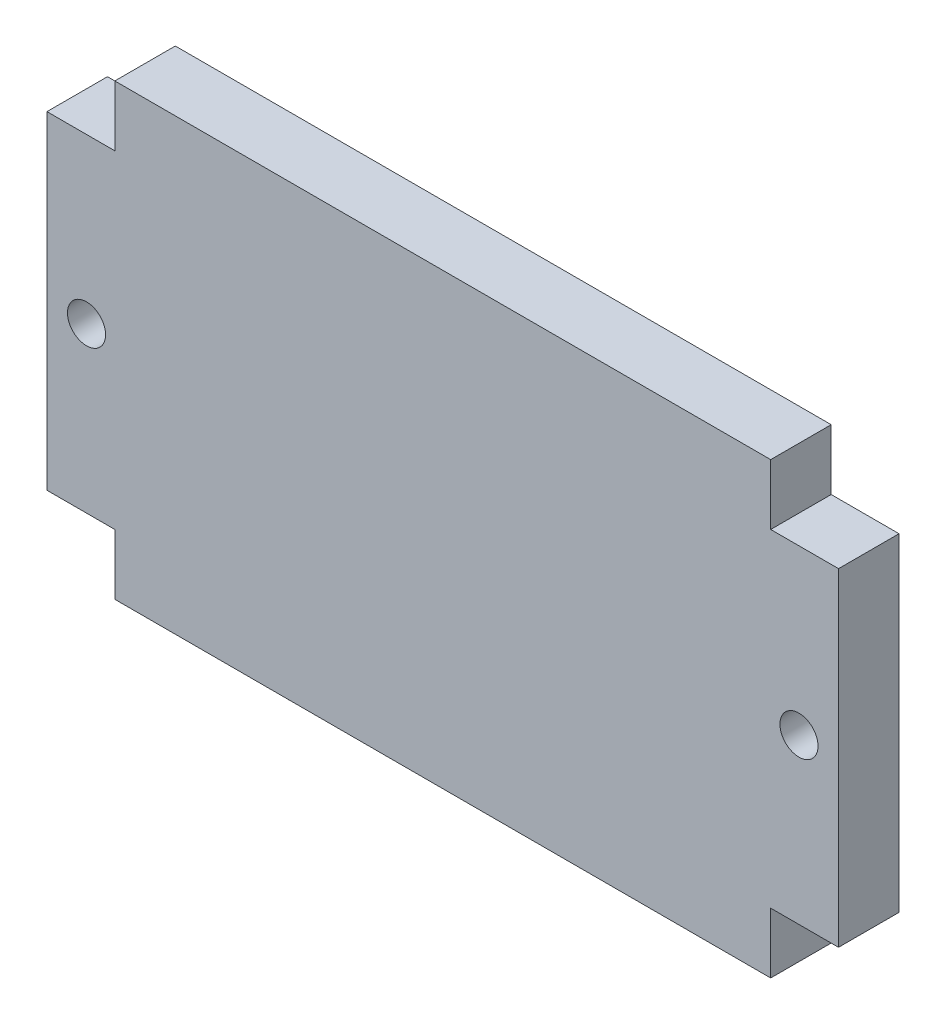
ISO-10303-21;
HEADER;
FILE_DESCRIPTION(('STEP AP214'),'2;1');
FILE_NAME('part.step','',(''),(''),'','','');
FILE_SCHEMA(('AUTOMOTIVE_DESIGN { 1 0 10303 214 1 1 1 1 }'));
ENDSEC;
DATA;
#1=APPLICATION_CONTEXT('core data for automotive mechanical design processes');
#2=APPLICATION_PROTOCOL_DEFINITION('international standard','automotive_design',2000,#1);
#3=PRODUCT_CONTEXT('',#1,'mechanical');
#4=PRODUCT('Part','Part','',(#3));
#5=PRODUCT_RELATED_PRODUCT_CATEGORY('part','',(#4));
#6=PRODUCT_DEFINITION_FORMATION('','',#4);
#7=PRODUCT_DEFINITION_CONTEXT('part definition',#1,'design');
#8=PRODUCT_DEFINITION('design','',#6,#7);
#9=PRODUCT_DEFINITION_SHAPE('','',#8);
#10=(LENGTH_UNIT() NAMED_UNIT(*) SI_UNIT(.MILLI.,.METRE.));
#11=(NAMED_UNIT(*) PLANE_ANGLE_UNIT() SI_UNIT($,.RADIAN.));
#12=(NAMED_UNIT(*) SI_UNIT($,.STERADIAN.) SOLID_ANGLE_UNIT());
#13=UNCERTAINTY_MEASURE_WITH_UNIT(LENGTH_MEASURE(1.E-05),#10,'distance_accuracy_value','');
#14=(GEOMETRIC_REPRESENTATION_CONTEXT(3) GLOBAL_UNCERTAINTY_ASSIGNED_CONTEXT((#13)) GLOBAL_UNIT_ASSIGNED_CONTEXT((#10,
#11,#12)) REPRESENTATION_CONTEXT('',''));
#15=CARTESIAN_POINT('',(0.,0.,0.));
#16=DIRECTION('',(0.,0.,1.));
#17=DIRECTION('',(1.,0.,0.));
#18=AXIS2_PLACEMENT_3D('',#15,#16,#17);
#19=CARTESIAN_POINT('',(0.,0.,5.35));
#20=DIRECTION('',(0.,0.,1.));
#21=DIRECTION('',(1.,0.,0.));
#22=AXIS2_PLACEMENT_3D('',#19,#20,#21);
#23=PLANE('',#22);
#24=CARTESIAN_POINT('',(-31.5,19.85,5.35));
#25=DIRECTION('',(0.,0.,1.));
#26=DIRECTION('',(1.,0.,0.));
#27=AXIS2_PLACEMENT_3D('',#24,#25,#26);
#28=CIRCLE('',#27,1.685);
#29=CARTESIAN_POINT('',(-29.815,19.85,5.35));
#30=VERTEX_POINT('',#29);
#31=EDGE_CURVE('E157',#30,#30,#28,.T.);
#32=ORIENTED_EDGE('',*,*,#31,.F.);
#33=EDGE_LOOP('',(#32));
#34=FACE_BOUND('',#33,.T.);
#35=DIRECTION('',(0.,-1.,0.));
#36=VECTOR('',#35,1.);
#37=CARTESIAN_POINT('',(-29.,0.,5.35));
#38=LINE('',#37,#36);
#39=CARTESIAN_POINT('',(-29.,5.35,5.35));
#40=VERTEX_POINT('',#39);
#41=CARTESIAN_POINT('',(-29.,0.,5.35));
#42=VERTEX_POINT('',#41);
#43=EDGE_CURVE('E176',#40,#42,#38,.T.);
#44=ORIENTED_EDGE('',*,*,#43,.T.);
#45=DIRECTION('',(1.,0.,0.));
#46=VECTOR('',#45,1.);
#47=CARTESIAN_POINT('',(-29.,0.,5.35));
#48=LINE('',#47,#46);
#49=CARTESIAN_POINT('',(29.,0.,5.35));
#50=VERTEX_POINT('',#49);
#51=EDGE_CURVE('E104',#42,#50,#48,.T.);
#52=ORIENTED_EDGE('',*,*,#51,.T.);
#53=DIRECTION('',(0.,1.,0.));
#54=VECTOR('',#53,1.);
#55=CARTESIAN_POINT('',(29.,0.,5.35));
#56=LINE('',#55,#54);
#57=CARTESIAN_POINT('',(29.,5.35,5.35));
#58=VERTEX_POINT('',#57);
#59=EDGE_CURVE('E203',#50,#58,#56,.T.);
#60=ORIENTED_EDGE('',*,*,#59,.T.);
#61=DIRECTION('',(1.,0.,0.));
#62=VECTOR('',#61,1.);
#63=CARTESIAN_POINT('',(29.,5.35,5.35));
#64=LINE('',#63,#62);
#65=CARTESIAN_POINT('',(35.,5.35,5.35));
#66=VERTEX_POINT('',#65);
#67=EDGE_CURVE('E222',#58,#66,#64,.T.);
#68=ORIENTED_EDGE('',*,*,#67,.T.);
#69=DIRECTION('',(0.,1.,0.));
#70=VECTOR('',#69,1.);
#71=CARTESIAN_POINT('',(35.,34.35,5.35));
#72=LINE('',#71,#70);
#73=CARTESIAN_POINT('',(35.,34.35,5.35));
#74=VERTEX_POINT('',#73);
#75=EDGE_CURVE('E219',#66,#74,#72,.T.);
#76=ORIENTED_EDGE('',*,*,#75,.T.);
#77=DIRECTION('',(-1.,0.,0.));
#78=VECTOR('',#77,1.);
#79=CARTESIAN_POINT('',(29.,34.35,5.35));
#80=LINE('',#79,#78);
#81=CARTESIAN_POINT('',(29.,34.35,5.35));
#82=VERTEX_POINT('',#81);
#83=EDGE_CURVE('E221',#74,#82,#80,.T.);
#84=ORIENTED_EDGE('',*,*,#83,.T.);
#85=DIRECTION('',(0.,1.,0.));
#86=VECTOR('',#85,1.);
#87=CARTESIAN_POINT('',(29.,34.35,5.35));
#88=LINE('',#87,#86);
#89=CARTESIAN_POINT('',(29.,39.7,5.35));
#90=VERTEX_POINT('',#89);
#91=EDGE_CURVE('E224',#82,#90,#88,.T.);
#92=ORIENTED_EDGE('',*,*,#91,.T.);
#93=DIRECTION('',(-1.,0.,0.));
#94=VECTOR('',#93,1.);
#95=CARTESIAN_POINT('',(-29.,39.7,5.35));
#96=LINE('',#95,#94);
#97=CARTESIAN_POINT('',(-29.,39.7,5.35));
#98=VERTEX_POINT('',#97);
#99=EDGE_CURVE('E230',#90,#98,#96,.T.);
#100=ORIENTED_EDGE('',*,*,#99,.T.);
#101=DIRECTION('',(0.,-1.,0.));
#102=VECTOR('',#101,1.);
#103=CARTESIAN_POINT('',(-29.,34.35,5.35));
#104=LINE('',#103,#102);
#105=CARTESIAN_POINT('',(-29.,34.35,5.35));
#106=VERTEX_POINT('',#105);
#107=EDGE_CURVE('E135',#98,#106,#104,.T.);
#108=ORIENTED_EDGE('',*,*,#107,.T.);
#109=DIRECTION('',(-1.,0.,0.));
#110=VECTOR('',#109,1.);
#111=CARTESIAN_POINT('',(-29.,34.35,5.35));
#112=LINE('',#111,#110);
#113=CARTESIAN_POINT('',(-35.,34.35,5.35));
#114=VERTEX_POINT('',#113);
#115=EDGE_CURVE('E129',#106,#114,#112,.T.);
#116=ORIENTED_EDGE('',*,*,#115,.T.);
#117=DIRECTION('',(0.,-1.,0.));
#118=VECTOR('',#117,1.);
#119=CARTESIAN_POINT('',(-35.,34.35,5.35));
#120=LINE('',#119,#118);
#121=CARTESIAN_POINT('',(-35.,5.35,5.35));
#122=VERTEX_POINT('',#121);
#123=EDGE_CURVE('E133',#114,#122,#120,.T.);
#124=ORIENTED_EDGE('',*,*,#123,.T.);
#125=DIRECTION('',(1.,0.,0.));
#126=VECTOR('',#125,1.);
#127=CARTESIAN_POINT('',(-29.,5.35,5.35));
#128=LINE('',#127,#126);
#129=EDGE_CURVE('E49',#122,#40,#128,.T.);
#130=ORIENTED_EDGE('',*,*,#129,.T.);
#131=EDGE_LOOP('',(#44,#52,#60,#68,#76,#84,#92,#100,#108,#116,#124,#130));
#132=FACE_BOUND('',#131,.T.);
#133=CARTESIAN_POINT('',(31.5,19.85,5.35));
#134=DIRECTION('',(0.,0.,1.));
#135=DIRECTION('',(-1.,0.,0.));
#136=AXIS2_PLACEMENT_3D('',#133,#134,#135);
#137=CIRCLE('',#136,1.685);
#138=CARTESIAN_POINT('',(29.815,19.85,5.35));
#139=VERTEX_POINT('',#138);
#140=EDGE_CURVE('E272',#139,#139,#137,.T.);
#141=ORIENTED_EDGE('',*,*,#140,.F.);
#142=EDGE_LOOP('',(#141));
#143=FACE_BOUND('',#142,.T.);
#144=ADVANCED_FACE('F32',(#34,#132,#143),#23,.T.);
#145=CARTESIAN_POINT('',(0.,0.,0.));
#146=DIRECTION('',(0.,0.,1.));
#147=DIRECTION('',(1.,0.,0.));
#148=AXIS2_PLACEMENT_3D('',#145,#146,#147);
#149=PLANE('',#148);
#150=DIRECTION('',(0.,-1.,0.));
#151=VECTOR('',#150,1.);
#152=CARTESIAN_POINT('',(-29.,0.,0.));
#153=LINE('',#152,#151);
#154=CARTESIAN_POINT('',(-29.,5.35,0.));
#155=VERTEX_POINT('',#154);
#156=CARTESIAN_POINT('',(-29.,0.,0.));
#157=VERTEX_POINT('',#156);
#158=EDGE_CURVE('E153',#155,#157,#153,.T.);
#159=ORIENTED_EDGE('',*,*,#158,.F.);
#160=DIRECTION('',(1.,0.,0.));
#161=VECTOR('',#160,1.);
#162=CARTESIAN_POINT('',(-29.,5.35,0.));
#163=LINE('',#162,#161);
#164=CARTESIAN_POINT('',(-35.,5.35,0.));
#165=VERTEX_POINT('',#164);
#166=EDGE_CURVE('E96',#165,#155,#163,.T.);
#167=ORIENTED_EDGE('',*,*,#166,.F.);
#168=DIRECTION('',(0.,-1.,0.));
#169=VECTOR('',#168,1.);
#170=CARTESIAN_POINT('',(-35.,34.35,0.));
#171=LINE('',#170,#169);
#172=CARTESIAN_POINT('',(-35.,34.35,0.));
#173=VERTEX_POINT('',#172);
#174=EDGE_CURVE('E90',#173,#165,#171,.T.);
#175=ORIENTED_EDGE('',*,*,#174,.F.);
#176=DIRECTION('',(-1.,0.,0.));
#177=VECTOR('',#176,1.);
#178=CARTESIAN_POINT('',(-29.,34.35,0.));
#179=LINE('',#178,#177);
#180=CARTESIAN_POINT('',(-29.,34.35,0.));
#181=VERTEX_POINT('',#180);
#182=EDGE_CURVE('E143',#181,#173,#179,.T.);
#183=ORIENTED_EDGE('',*,*,#182,.F.);
#184=DIRECTION('',(0.,-1.,0.));
#185=VECTOR('',#184,1.);
#186=CARTESIAN_POINT('',(-29.,34.35,0.));
#187=LINE('',#186,#185);
#188=CARTESIAN_POINT('',(-29.,39.7,0.));
#189=VERTEX_POINT('',#188);
#190=EDGE_CURVE('E171',#189,#181,#187,.T.);
#191=ORIENTED_EDGE('',*,*,#190,.F.);
#192=DIRECTION('',(-1.,0.,0.));
#193=VECTOR('',#192,1.);
#194=CARTESIAN_POINT('',(-29.,39.7,0.));
#195=LINE('',#194,#193);
#196=CARTESIAN_POINT('',(29.,39.7,0.));
#197=VERTEX_POINT('',#196);
#198=EDGE_CURVE('E169',#197,#189,#195,.T.);
#199=ORIENTED_EDGE('',*,*,#198,.F.);
#200=DIRECTION('',(0.,1.,0.));
#201=VECTOR('',#200,1.);
#202=CARTESIAN_POINT('',(29.,34.35,0.));
#203=LINE('',#202,#201);
#204=CARTESIAN_POINT('',(29.,34.35,0.));
#205=VERTEX_POINT('',#204);
#206=EDGE_CURVE('E167',#205,#197,#203,.T.);
#207=ORIENTED_EDGE('',*,*,#206,.F.);
#208=DIRECTION('',(-1.,0.,0.));
#209=VECTOR('',#208,1.);
#210=CARTESIAN_POINT('',(29.,34.35,0.));
#211=LINE('',#210,#209);
#212=CARTESIAN_POINT('',(35.,34.35,0.));
#213=VERTEX_POINT('',#212);
#214=EDGE_CURVE('E165',#213,#205,#211,.T.);
#215=ORIENTED_EDGE('',*,*,#214,.F.);
#216=DIRECTION('',(0.,1.,0.));
#217=VECTOR('',#216,1.);
#218=CARTESIAN_POINT('',(35.,34.35,0.));
#219=LINE('',#218,#217);
#220=CARTESIAN_POINT('',(35.,5.35,0.));
#221=VERTEX_POINT('',#220);
#222=EDGE_CURVE('E163',#221,#213,#219,.T.);
#223=ORIENTED_EDGE('',*,*,#222,.F.);
#224=DIRECTION('',(1.,0.,0.));
#225=VECTOR('',#224,1.);
#226=CARTESIAN_POINT('',(29.,5.35,0.));
#227=LINE('',#226,#225);
#228=CARTESIAN_POINT('',(29.,5.35,0.));
#229=VERTEX_POINT('',#228);
#230=EDGE_CURVE('E161',#229,#221,#227,.T.);
#231=ORIENTED_EDGE('',*,*,#230,.F.);
#232=DIRECTION('',(0.,1.,0.));
#233=VECTOR('',#232,1.);
#234=CARTESIAN_POINT('',(29.,0.,0.));
#235=LINE('',#234,#233);
#236=CARTESIAN_POINT('',(29.,0.,0.));
#237=VERTEX_POINT('',#236);
#238=EDGE_CURVE('E159',#237,#229,#235,.T.);
#239=ORIENTED_EDGE('',*,*,#238,.F.);
#240=DIRECTION('',(1.,0.,0.));
#241=VECTOR('',#240,1.);
#242=CARTESIAN_POINT('',(-29.,0.,0.));
#243=LINE('',#242,#241);
#244=EDGE_CURVE('E156',#157,#237,#243,.T.);
#245=ORIENTED_EDGE('',*,*,#244,.F.);
#246=EDGE_LOOP('',(#159,#167,#175,#183,#191,#199,#207,#215,#223,#231,#239,#245));
#247=FACE_BOUND('',#246,.T.);
#248=CARTESIAN_POINT('',(-31.5,19.85,0.));
#249=DIRECTION('',(0.,0.,1.));
#250=DIRECTION('',(1.,0.,0.));
#251=AXIS2_PLACEMENT_3D('',#248,#249,#250);
#252=CIRCLE('',#251,1.685);
#253=CARTESIAN_POINT('',(-29.815,19.85,0.));
#254=VERTEX_POINT('',#253);
#255=EDGE_CURVE('E278',#254,#254,#252,.T.);
#256=ORIENTED_EDGE('',*,*,#255,.T.);
#257=EDGE_LOOP('',(#256));
#258=FACE_BOUND('',#257,.T.);
#259=CARTESIAN_POINT('',(31.5,19.85,0.));
#260=DIRECTION('',(0.,0.,1.));
#261=DIRECTION('',(-1.,0.,0.));
#262=AXIS2_PLACEMENT_3D('',#259,#260,#261);
#263=CIRCLE('',#262,1.685);
#264=CARTESIAN_POINT('',(29.815,19.85,0.));
#265=VERTEX_POINT('',#264);
#266=EDGE_CURVE('E275',#265,#265,#263,.T.);
#267=ORIENTED_EDGE('',*,*,#266,.T.);
#268=EDGE_LOOP('',(#267));
#269=FACE_BOUND('',#268,.T.);
#270=ADVANCED_FACE('F207',(#247,#258,#269),#149,.F.);
#271=CARTESIAN_POINT('',(-29.,0.,5.35));
#272=DIRECTION('',(1.,0.,0.));
#273=DIRECTION('',(0.,1.,0.));
#274=AXIS2_PLACEMENT_3D('',#271,#272,#273);
#275=PLANE('',#274);
#276=ORIENTED_EDGE('',*,*,#158,.T.);
#277=DIRECTION('',(0.,0.,-1.));
#278=VECTOR('',#277,1.);
#279=CARTESIAN_POINT('',(-29.,0.,5.35));
#280=LINE('',#279,#278);
#281=EDGE_CURVE('E11',#42,#157,#280,.T.);
#282=ORIENTED_EDGE('',*,*,#281,.F.);
#283=ORIENTED_EDGE('',*,*,#43,.F.);
#284=DIRECTION('',(0.,0.,-1.));
#285=VECTOR('',#284,1.);
#286=CARTESIAN_POINT('',(-29.,5.35,5.35));
#287=LINE('',#286,#285);
#288=EDGE_CURVE('E149',#40,#155,#287,.T.);
#289=ORIENTED_EDGE('',*,*,#288,.T.);
#290=EDGE_LOOP('',(#276,#282,#283,#289));
#291=FACE_BOUND('',#290,.T.);
#292=ADVANCED_FACE('F34',(#291),#275,.F.);
#293=CARTESIAN_POINT('',(-29.,0.,5.35));
#294=DIRECTION('',(0.,1.,0.));
#295=DIRECTION('',(-1.,0.,0.));
#296=AXIS2_PLACEMENT_3D('',#293,#294,#295);
#297=PLANE('',#296);
#298=ORIENTED_EDGE('',*,*,#244,.T.);
#299=DIRECTION('',(0.,0.,-1.));
#300=VECTOR('',#299,1.);
#301=CARTESIAN_POINT('',(29.,0.,5.35));
#302=LINE('',#301,#300);
#303=EDGE_CURVE('E41',#50,#237,#302,.T.);
#304=ORIENTED_EDGE('',*,*,#303,.F.);
#305=ORIENTED_EDGE('',*,*,#51,.F.);
#306=ORIENTED_EDGE('',*,*,#281,.T.);
#307=EDGE_LOOP('',(#298,#304,#305,#306));
#308=FACE_BOUND('',#307,.T.);
#309=ADVANCED_FACE('F371',(#308),#297,.F.);
#310=CARTESIAN_POINT('',(29.,0.,5.35));
#311=DIRECTION('',(-1.,0.,0.));
#312=DIRECTION('',(0.,-1.,0.));
#313=AXIS2_PLACEMENT_3D('',#310,#311,#312);
#314=PLANE('',#313);
#315=ORIENTED_EDGE('',*,*,#238,.T.);
#316=DIRECTION('',(0.,0.,-1.));
#317=VECTOR('',#316,1.);
#318=CARTESIAN_POINT('',(29.,5.35,5.35));
#319=LINE('',#318,#317);
#320=EDGE_CURVE('E195',#58,#229,#319,.T.);
#321=ORIENTED_EDGE('',*,*,#320,.F.);
#322=ORIENTED_EDGE('',*,*,#59,.F.);
#323=ORIENTED_EDGE('',*,*,#303,.T.);
#324=EDGE_LOOP('',(#315,#321,#322,#323));
#325=FACE_BOUND('',#324,.T.);
#326=ADVANCED_FACE('F201',(#325),#314,.F.);
#327=CARTESIAN_POINT('',(29.,5.35,5.35));
#328=DIRECTION('',(0.,1.,0.));
#329=DIRECTION('',(0.,0.,1.));
#330=AXIS2_PLACEMENT_3D('',#327,#328,#329);
#331=PLANE('',#330);
#332=ORIENTED_EDGE('',*,*,#230,.T.);
#333=DIRECTION('',(0.,0.,-1.));
#334=VECTOR('',#333,1.);
#335=CARTESIAN_POINT('',(35.,5.35,5.35));
#336=LINE('',#335,#334);
#337=EDGE_CURVE('E192',#66,#221,#336,.T.);
#338=ORIENTED_EDGE('',*,*,#337,.F.);
#339=ORIENTED_EDGE('',*,*,#67,.F.);
#340=ORIENTED_EDGE('',*,*,#320,.T.);
#341=EDGE_LOOP('',(#332,#338,#339,#340));
#342=FACE_BOUND('',#341,.T.);
#343=ADVANCED_FACE('F213',(#342),#331,.F.);
#344=CARTESIAN_POINT('',(35.,34.35,5.35));
#345=DIRECTION('',(-1.,0.,0.));
#346=DIRECTION('',(0.,0.,1.));
#347=AXIS2_PLACEMENT_3D('',#344,#345,#346);
#348=PLANE('',#347);
#349=ORIENTED_EDGE('',*,*,#222,.T.);
#350=DIRECTION('',(0.,0.,-1.));
#351=VECTOR('',#350,1.);
#352=CARTESIAN_POINT('',(35.,34.35,5.35));
#353=LINE('',#352,#351);
#354=EDGE_CURVE('E189',#74,#213,#353,.T.);
#355=ORIENTED_EDGE('',*,*,#354,.F.);
#356=ORIENTED_EDGE('',*,*,#75,.F.);
#357=ORIENTED_EDGE('',*,*,#337,.T.);
#358=EDGE_LOOP('',(#349,#355,#356,#357));
#359=FACE_BOUND('',#358,.T.);
#360=ADVANCED_FACE('F217',(#359),#348,.F.);
#361=CARTESIAN_POINT('',(29.,34.35,5.35));
#362=DIRECTION('',(0.,-1.,0.));
#363=DIRECTION('',(0.,0.,-1.));
#364=AXIS2_PLACEMENT_3D('',#361,#362,#363);
#365=PLANE('',#364);
#366=ORIENTED_EDGE('',*,*,#214,.T.);
#367=DIRECTION('',(0.,0.,-1.));
#368=VECTOR('',#367,1.);
#369=CARTESIAN_POINT('',(29.,34.35,5.35));
#370=LINE('',#369,#368);
#371=EDGE_CURVE('E186',#82,#205,#370,.T.);
#372=ORIENTED_EDGE('',*,*,#371,.F.);
#373=ORIENTED_EDGE('',*,*,#83,.F.);
#374=ORIENTED_EDGE('',*,*,#354,.T.);
#375=EDGE_LOOP('',(#366,#372,#373,#374));
#376=FACE_BOUND('',#375,.T.);
#377=ADVANCED_FACE('F336',(#376),#365,.F.);
#378=CARTESIAN_POINT('',(29.,34.35,5.35));
#379=DIRECTION('',(-1.,0.,0.));
#380=DIRECTION('',(0.,-1.,0.));
#381=AXIS2_PLACEMENT_3D('',#378,#379,#380);
#382=PLANE('',#381);
#383=ORIENTED_EDGE('',*,*,#206,.T.);
#384=DIRECTION('',(0.,0.,-1.));
#385=VECTOR('',#384,1.);
#386=CARTESIAN_POINT('',(29.,39.7,5.35));
#387=LINE('',#386,#385);
#388=EDGE_CURVE('E183',#90,#197,#387,.T.);
#389=ORIENTED_EDGE('',*,*,#388,.F.);
#390=ORIENTED_EDGE('',*,*,#91,.F.);
#391=ORIENTED_EDGE('',*,*,#371,.T.);
#392=EDGE_LOOP('',(#383,#389,#390,#391));
#393=FACE_BOUND('',#392,.T.);
#394=ADVANCED_FACE('F327',(#393),#382,.F.);
#395=CARTESIAN_POINT('',(-29.,39.7,5.35));
#396=DIRECTION('',(0.,-1.,0.));
#397=DIRECTION('',(0.,0.,-1.));
#398=AXIS2_PLACEMENT_3D('',#395,#396,#397);
#399=PLANE('',#398);
#400=ORIENTED_EDGE('',*,*,#198,.T.);
#401=DIRECTION('',(0.,0.,-1.));
#402=VECTOR('',#401,1.);
#403=CARTESIAN_POINT('',(-29.,39.7,5.35));
#404=LINE('',#403,#402);
#405=EDGE_CURVE('E180',#98,#189,#404,.T.);
#406=ORIENTED_EDGE('',*,*,#405,.F.);
#407=ORIENTED_EDGE('',*,*,#99,.F.);
#408=ORIENTED_EDGE('',*,*,#388,.T.);
#409=EDGE_LOOP('',(#400,#406,#407,#408));
#410=FACE_BOUND('',#409,.T.);
#411=ADVANCED_FACE('F236',(#410),#399,.F.);
#412=CARTESIAN_POINT('',(-29.,34.35,5.35));
#413=DIRECTION('',(1.,0.,0.));
#414=DIRECTION('',(0.,0.,-1.));
#415=AXIS2_PLACEMENT_3D('',#412,#413,#414);
#416=PLANE('',#415);
#417=ORIENTED_EDGE('',*,*,#190,.T.);
#418=DIRECTION('',(0.,0.,-1.));
#419=VECTOR('',#418,1.);
#420=CARTESIAN_POINT('',(-29.,34.35,5.35));
#421=LINE('',#420,#419);
#422=EDGE_CURVE('E144',#106,#181,#421,.T.);
#423=ORIENTED_EDGE('',*,*,#422,.F.);
#424=ORIENTED_EDGE('',*,*,#107,.F.);
#425=ORIENTED_EDGE('',*,*,#405,.T.);
#426=EDGE_LOOP('',(#417,#423,#424,#425));
#427=FACE_BOUND('',#426,.T.);
#428=ADVANCED_FACE('F240',(#427),#416,.F.);
#429=CARTESIAN_POINT('',(-29.,34.35,5.35));
#430=DIRECTION('',(0.,-1.,0.));
#431=DIRECTION('',(0.,0.,-1.));
#432=AXIS2_PLACEMENT_3D('',#429,#430,#431);
#433=PLANE('',#432);
#434=ORIENTED_EDGE('',*,*,#182,.T.);
#435=DIRECTION('',(0.,0.,-1.));
#436=VECTOR('',#435,1.);
#437=CARTESIAN_POINT('',(-35.,34.35,5.35));
#438=LINE('',#437,#436);
#439=EDGE_CURVE('E140',#114,#173,#438,.T.);
#440=ORIENTED_EDGE('',*,*,#439,.F.);
#441=ORIENTED_EDGE('',*,*,#115,.F.);
#442=ORIENTED_EDGE('',*,*,#422,.T.);
#443=EDGE_LOOP('',(#434,#440,#441,#442));
#444=FACE_BOUND('',#443,.T.);
#445=ADVANCED_FACE('F141',(#444),#433,.F.);
#446=CARTESIAN_POINT('',(-35.,34.35,5.35));
#447=DIRECTION('',(1.,0.,0.));
#448=DIRECTION('',(0.,0.,-1.));
#449=AXIS2_PLACEMENT_3D('',#446,#447,#448);
#450=PLANE('',#449);
#451=ORIENTED_EDGE('',*,*,#174,.T.);
#452=DIRECTION('',(0.,0.,-1.));
#453=VECTOR('',#452,1.);
#454=CARTESIAN_POINT('',(-35.,5.35,5.35));
#455=LINE('',#454,#453);
#456=EDGE_CURVE('E145',#122,#165,#455,.T.);
#457=ORIENTED_EDGE('',*,*,#456,.F.);
#458=ORIENTED_EDGE('',*,*,#123,.F.);
#459=ORIENTED_EDGE('',*,*,#439,.T.);
#460=EDGE_LOOP('',(#451,#457,#458,#459));
#461=FACE_BOUND('',#460,.T.);
#462=ADVANCED_FACE('F147',(#461),#450,.F.);
#463=CARTESIAN_POINT('',(-29.,5.35,5.35));
#464=DIRECTION('',(0.,1.,0.));
#465=DIRECTION('',(0.,0.,1.));
#466=AXIS2_PLACEMENT_3D('',#463,#464,#465);
#467=PLANE('',#466);
#468=ORIENTED_EDGE('',*,*,#166,.T.);
#469=ORIENTED_EDGE('',*,*,#288,.F.);
#470=ORIENTED_EDGE('',*,*,#129,.F.);
#471=ORIENTED_EDGE('',*,*,#456,.T.);
#472=EDGE_LOOP('',(#468,#469,#470,#471));
#473=FACE_BOUND('',#472,.T.);
#474=ADVANCED_FACE('F244',(#473),#467,.F.);
#475=CARTESIAN_POINT('',(-31.5,19.85,5.35));
#476=DIRECTION('',(0.,0.,-1.));
#477=DIRECTION('',(-1.,0.,0.));
#478=AXIS2_PLACEMENT_3D('',#475,#476,#477);
#479=CYLINDRICAL_SURFACE('',#478,1.685);
#480=ORIENTED_EDGE('',*,*,#31,.T.);
#481=EDGE_LOOP('',(#480));
#482=FACE_BOUND('',#481,.T.);
#483=ORIENTED_EDGE('',*,*,#255,.F.);
#484=EDGE_LOOP('',(#483));
#485=FACE_BOUND('',#484,.T.);
#486=ADVANCED_FACE('F246',(#482,#485),#479,.F.);
#487=CARTESIAN_POINT('',(31.5,19.85,5.35));
#488=DIRECTION('',(0.,0.,-1.));
#489=DIRECTION('',(-1.,0.,0.));
#490=AXIS2_PLACEMENT_3D('',#487,#488,#489);
#491=CYLINDRICAL_SURFACE('',#490,1.685);
#492=ORIENTED_EDGE('',*,*,#140,.T.);
#493=EDGE_LOOP('',(#492));
#494=FACE_BOUND('',#493,.T.);
#495=ORIENTED_EDGE('',*,*,#266,.F.);
#496=EDGE_LOOP('',(#495));
#497=FACE_BOUND('',#496,.T.);
#498=ADVANCED_FACE('F252',(#494,#497),#491,.F.);
#499=CLOSED_SHELL('',(#144,#270,#292,#309,#326,#343,#360,#377,#394,#411,#428,#445,#462,#474,
#486,#498));
#500=MANIFOLD_SOLID_BREP('B2',#499);
#501=ADVANCED_BREP_SHAPE_REPRESENTATION('',(#18,#500),#14);
#502=SHAPE_DEFINITION_REPRESENTATION(#9,#501);
ENDSEC;
END-ISO-10303-21;
